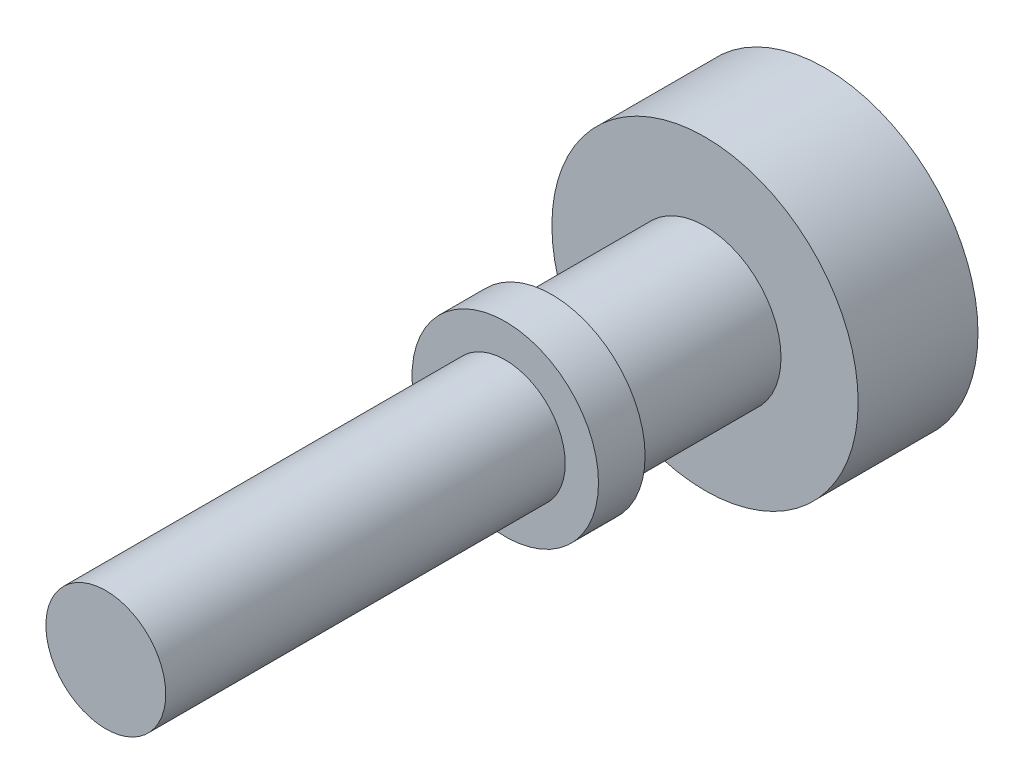
ISO-10303-21;
HEADER;
FILE_DESCRIPTION(('STEP AP214'),'2;1');
FILE_NAME('part.step','',(''),(''),'','','');
FILE_SCHEMA(('AUTOMOTIVE_DESIGN { 1 0 10303 214 1 1 1 1 }'));
ENDSEC;
DATA;
#1=APPLICATION_CONTEXT('core data for automotive mechanical design processes');
#2=APPLICATION_PROTOCOL_DEFINITION('international standard','automotive_design',2000,#1);
#3=PRODUCT_CONTEXT('',#1,'mechanical');
#4=PRODUCT('Part','Part','',(#3));
#5=PRODUCT_RELATED_PRODUCT_CATEGORY('part','',(#4));
#6=PRODUCT_DEFINITION_FORMATION('','',#4);
#7=PRODUCT_DEFINITION_CONTEXT('part definition',#1,'design');
#8=PRODUCT_DEFINITION('design','',#6,#7);
#9=PRODUCT_DEFINITION_SHAPE('','',#8);
#10=(LENGTH_UNIT() NAMED_UNIT(*) SI_UNIT(.MILLI.,.METRE.));
#11=(NAMED_UNIT(*) PLANE_ANGLE_UNIT() SI_UNIT($,.RADIAN.));
#12=(NAMED_UNIT(*) SI_UNIT($,.STERADIAN.) SOLID_ANGLE_UNIT());
#13=UNCERTAINTY_MEASURE_WITH_UNIT(LENGTH_MEASURE(1.E-05),#10,'distance_accuracy_value','');
#14=(GEOMETRIC_REPRESENTATION_CONTEXT(3) GLOBAL_UNCERTAINTY_ASSIGNED_CONTEXT((#13)) GLOBAL_UNIT_ASSIGNED_CONTEXT((#10,
#11,#12)) REPRESENTATION_CONTEXT('',''));
#15=CARTESIAN_POINT('',(0.,0.,0.));
#16=DIRECTION('',(0.,0.,1.));
#17=DIRECTION('',(1.,0.,0.));
#18=AXIS2_PLACEMENT_3D('',#15,#16,#17);
#19=CARTESIAN_POINT('',(0.,0.,4.5));
#20=DIRECTION('',(0.,0.,-1.));
#21=DIRECTION('',(-1.,0.,0.));
#22=AXIS2_PLACEMENT_3D('',#19,#20,#21);
#23=CYLINDRICAL_SURFACE('',#22,5.75);
#24=CARTESIAN_POINT('',(0.,0.,4.5));
#25=DIRECTION('',(0.,0.,1.));
#26=DIRECTION('',(1.,0.,0.));
#27=AXIS2_PLACEMENT_3D('',#24,#25,#26);
#28=CIRCLE('',#27,5.75);
#29=CARTESIAN_POINT('',(5.75,0.,4.5));
#30=VERTEX_POINT('',#29);
#31=EDGE_CURVE('E51',#30,#30,#28,.T.);
#32=ORIENTED_EDGE('',*,*,#31,.F.);
#33=EDGE_LOOP('',(#32));
#34=FACE_BOUND('',#33,.T.);
#35=CARTESIAN_POINT('',(0.,0.,0.));
#36=DIRECTION('',(0.,0.,1.));
#37=DIRECTION('',(1.,0.,0.));
#38=AXIS2_PLACEMENT_3D('',#35,#36,#37);
#39=CIRCLE('',#38,5.75);
#40=CARTESIAN_POINT('',(5.75,0.,0.));
#41=VERTEX_POINT('',#40);
#42=EDGE_CURVE('E40',#41,#41,#39,.T.);
#43=ORIENTED_EDGE('',*,*,#42,.T.);
#44=EDGE_LOOP('',(#43));
#45=FACE_BOUND('',#44,.T.);
#46=ADVANCED_FACE('F37',(#34,#45),#23,.T.);
#47=CARTESIAN_POINT('',(0.,0.,4.5));
#48=DIRECTION('',(0.,0.,1.));
#49=DIRECTION('',(1.,0.,0.));
#50=AXIS2_PLACEMENT_3D('',#47,#48,#49);
#51=PLANE('',#50);
#52=CARTESIAN_POINT('',(0.,0.,4.5));
#53=DIRECTION('',(0.,0.,1.));
#54=DIRECTION('',(1.,0.,0.));
#55=AXIS2_PLACEMENT_3D('',#52,#53,#54);
#56=CIRCLE('',#55,2.85361774534451);
#57=CARTESIAN_POINT('',(2.85361774534451,0.,4.5));
#58=VERTEX_POINT('',#57);
#59=EDGE_CURVE('E45',#58,#58,#56,.T.);
#60=ORIENTED_EDGE('',*,*,#59,.F.);
#61=EDGE_LOOP('',(#60));
#62=FACE_BOUND('',#61,.T.);
#63=ORIENTED_EDGE('',*,*,#31,.T.);
#64=EDGE_LOOP('',(#63));
#65=FACE_BOUND('',#64,.T.);
#66=ADVANCED_FACE('F79',(#62,#65),#51,.T.);
#67=CARTESIAN_POINT('',(0.,0.,0.));
#68=DIRECTION('',(0.,0.,1.));
#69=DIRECTION('',(1.,0.,0.));
#70=AXIS2_PLACEMENT_3D('',#67,#68,#69);
#71=PLANE('',#70);
#72=ORIENTED_EDGE('',*,*,#42,.F.);
#73=EDGE_LOOP('',(#72));
#74=FACE_BOUND('',#73,.T.);
#75=ADVANCED_FACE('F76',(#74),#71,.F.);
#76=CARTESIAN_POINT('',(0.,0.,10.25));
#77=DIRECTION('',(0.,0.,-1.));
#78=DIRECTION('',(-1.,0.,0.));
#79=AXIS2_PLACEMENT_3D('',#76,#77,#78);
#80=CYLINDRICAL_SURFACE('',#79,2.85361774534451);
#81=CARTESIAN_POINT('',(0.,0.,10.25));
#82=DIRECTION('',(0.,0.,1.));
#83=DIRECTION('',(1.,0.,0.));
#84=AXIS2_PLACEMENT_3D('',#81,#82,#83);
#85=CIRCLE('',#84,2.85361774534451);
#86=CARTESIAN_POINT('',(2.85361774534451,0.,10.25));
#87=VERTEX_POINT('',#86);
#88=EDGE_CURVE('E60',#87,#87,#85,.T.);
#89=ORIENTED_EDGE('',*,*,#88,.F.);
#90=EDGE_LOOP('',(#89));
#91=FACE_BOUND('',#90,.T.);
#92=ORIENTED_EDGE('',*,*,#59,.T.);
#93=EDGE_LOOP('',(#92));
#94=FACE_BOUND('',#93,.T.);
#95=ADVANCED_FACE('F78',(#91,#94),#80,.T.);
#96=CARTESIAN_POINT('',(0.,0.,12.));
#97=DIRECTION('',(0.,0.,-1.));
#98=DIRECTION('',(-1.,0.,0.));
#99=AXIS2_PLACEMENT_3D('',#96,#97,#98);
#100=CYLINDRICAL_SURFACE('',#99,3.5);
#101=CARTESIAN_POINT('',(0.,0.,12.));
#102=DIRECTION('',(0.,0.,1.));
#103=DIRECTION('',(1.,0.,0.));
#104=AXIS2_PLACEMENT_3D('',#101,#102,#103);
#105=CIRCLE('',#104,3.5);
#106=CARTESIAN_POINT('',(3.5,0.,12.));
#107=VERTEX_POINT('',#106);
#108=EDGE_CURVE('E56',#107,#107,#105,.T.);
#109=ORIENTED_EDGE('',*,*,#108,.F.);
#110=EDGE_LOOP('',(#109));
#111=FACE_BOUND('',#110,.T.);
#112=CARTESIAN_POINT('',(0.,0.,10.25));
#113=DIRECTION('',(0.,0.,1.));
#114=DIRECTION('',(1.,0.,0.));
#115=AXIS2_PLACEMENT_3D('',#112,#113,#114);
#116=CIRCLE('',#115,3.5);
#117=CARTESIAN_POINT('',(3.5,0.,10.25));
#118=VERTEX_POINT('',#117);
#119=EDGE_CURVE('E61',#118,#118,#116,.T.);
#120=ORIENTED_EDGE('',*,*,#119,.T.);
#121=EDGE_LOOP('',(#120));
#122=FACE_BOUND('',#121,.T.);
#123=ADVANCED_FACE('F84',(#111,#122),#100,.T.);
#124=CARTESIAN_POINT('',(0.,0.,12.));
#125=DIRECTION('',(0.,0.,1.));
#126=DIRECTION('',(1.,0.,0.));
#127=AXIS2_PLACEMENT_3D('',#124,#125,#126);
#128=PLANE('',#127);
#129=CARTESIAN_POINT('',(0.,0.,12.));
#130=DIRECTION('',(0.,0.,1.));
#131=DIRECTION('',(1.,0.,0.));
#132=AXIS2_PLACEMENT_3D('',#129,#130,#131);
#133=CIRCLE('',#132,2.25);
#134=CARTESIAN_POINT('',(2.25,0.,12.));
#135=VERTEX_POINT('',#134);
#136=EDGE_CURVE('E10',#135,#135,#133,.T.);
#137=ORIENTED_EDGE('',*,*,#136,.F.);
#138=EDGE_LOOP('',(#137));
#139=FACE_BOUND('',#138,.T.);
#140=ORIENTED_EDGE('',*,*,#108,.T.);
#141=EDGE_LOOP('',(#140));
#142=FACE_BOUND('',#141,.T.);
#143=ADVANCED_FACE('F114',(#139,#142),#128,.T.);
#144=CARTESIAN_POINT('',(0.,0.,10.25));
#145=DIRECTION('',(0.,0.,1.));
#146=DIRECTION('',(1.,0.,0.));
#147=AXIS2_PLACEMENT_3D('',#144,#145,#146);
#148=PLANE('',#147);
#149=ORIENTED_EDGE('',*,*,#88,.T.);
#150=EDGE_LOOP('',(#149));
#151=FACE_BOUND('',#150,.T.);
#152=ORIENTED_EDGE('',*,*,#119,.F.);
#153=EDGE_LOOP('',(#152));
#154=FACE_BOUND('',#153,.T.);
#155=ADVANCED_FACE('F122',(#151,#154),#148,.F.);
#156=CARTESIAN_POINT('',(0.,0.,27.));
#157=DIRECTION('',(0.,0.,-1.));
#158=DIRECTION('',(-1.,0.,0.));
#159=AXIS2_PLACEMENT_3D('',#156,#157,#158);
#160=CYLINDRICAL_SURFACE('',#159,2.25);
#161=CARTESIAN_POINT('',(0.,0.,27.));
#162=DIRECTION('',(0.,0.,1.));
#163=DIRECTION('',(1.,0.,0.));
#164=AXIS2_PLACEMENT_3D('',#161,#162,#163);
#165=CIRCLE('',#164,2.25);
#166=CARTESIAN_POINT('',(2.25,0.,27.));
#167=VERTEX_POINT('',#166);
#168=EDGE_CURVE('E55',#167,#167,#165,.T.);
#169=ORIENTED_EDGE('',*,*,#168,.F.);
#170=EDGE_LOOP('',(#169));
#171=FACE_BOUND('',#170,.T.);
#172=ORIENTED_EDGE('',*,*,#136,.T.);
#173=EDGE_LOOP('',(#172));
#174=FACE_BOUND('',#173,.T.);
#175=ADVANCED_FACE('F127',(#171,#174),#160,.T.);
#176=CARTESIAN_POINT('',(0.,0.,27.));
#177=DIRECTION('',(0.,0.,1.));
#178=DIRECTION('',(1.,0.,0.));
#179=AXIS2_PLACEMENT_3D('',#176,#177,#178);
#180=PLANE('',#179);
#181=ORIENTED_EDGE('',*,*,#168,.T.);
#182=EDGE_LOOP('',(#181));
#183=FACE_BOUND('',#182,.T.);
#184=ADVANCED_FACE('F144',(#183),#180,.T.);
#185=CLOSED_SHELL('',(#46,#66,#75,#95,#123,#143,#155,#175,#184));
#186=MANIFOLD_SOLID_BREP('B2',#185);
#187=ADVANCED_BREP_SHAPE_REPRESENTATION('',(#18,#186),#14);
#188=SHAPE_DEFINITION_REPRESENTATION(#9,#187);
ENDSEC;
END-ISO-10303-21;
